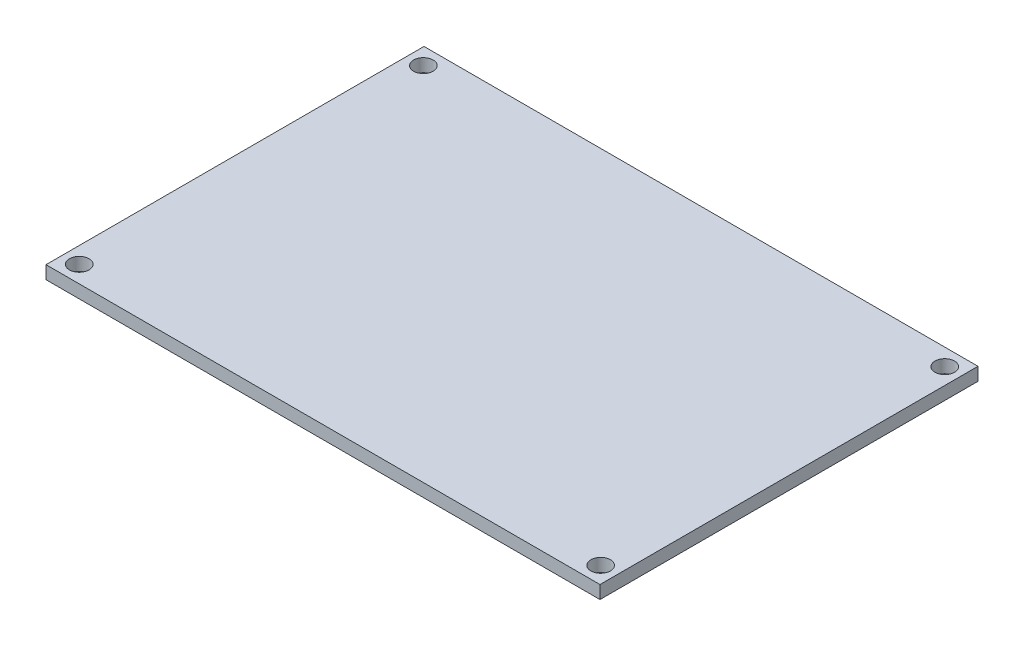
ISO-10303-21;
HEADER;
FILE_DESCRIPTION(('STEP AP214'),'2;1');
FILE_NAME('part.step','',(''),(''),'','','');
FILE_SCHEMA(('AUTOMOTIVE_DESIGN { 1 0 10303 214 1 1 1 1 }'));
ENDSEC;
DATA;
#1=APPLICATION_CONTEXT('core data for automotive mechanical design processes');
#2=APPLICATION_PROTOCOL_DEFINITION('international standard','automotive_design',2000,#1);
#3=PRODUCT_CONTEXT('',#1,'mechanical');
#4=PRODUCT('Part','Part','',(#3));
#5=PRODUCT_RELATED_PRODUCT_CATEGORY('part','',(#4));
#6=PRODUCT_DEFINITION_FORMATION('','',#4);
#7=PRODUCT_DEFINITION_CONTEXT('part definition',#1,'design');
#8=PRODUCT_DEFINITION('design','',#6,#7);
#9=PRODUCT_DEFINITION_SHAPE('','',#8);
#10=(LENGTH_UNIT() NAMED_UNIT(*) SI_UNIT(.MILLI.,.METRE.));
#11=(NAMED_UNIT(*) PLANE_ANGLE_UNIT() SI_UNIT($,.RADIAN.));
#12=(NAMED_UNIT(*) SI_UNIT($,.STERADIAN.) SOLID_ANGLE_UNIT());
#13=UNCERTAINTY_MEASURE_WITH_UNIT(LENGTH_MEASURE(1.E-05),#10,'distance_accuracy_value','');
#14=(GEOMETRIC_REPRESENTATION_CONTEXT(3) GLOBAL_UNCERTAINTY_ASSIGNED_CONTEXT((#13)) GLOBAL_UNIT_ASSIGNED_CONTEXT((#10,
#11,#12)) REPRESENTATION_CONTEXT('',''));
#15=CARTESIAN_POINT('',(0.,0.,0.));
#16=DIRECTION('',(0.,0.,1.));
#17=DIRECTION('',(1.,0.,0.));
#18=AXIS2_PLACEMENT_3D('',#15,#16,#17);
#19=CARTESIAN_POINT('',(42.5,2.,29.));
#20=DIRECTION('',(-1.,0.,0.));
#21=DIRECTION('',(0.,0.,1.));
#22=AXIS2_PLACEMENT_3D('',#19,#20,#21);
#23=PLANE('',#22);
#24=DIRECTION('',(0.,0.,-1.));
#25=VECTOR('',#24,1.);
#26=CARTESIAN_POINT('',(42.5,0.,29.));
#27=LINE('',#26,#25);
#28=CARTESIAN_POINT('',(42.5,0.,29.));
#29=VERTEX_POINT('',#28);
#30=CARTESIAN_POINT('',(42.5,0.,-29.));
#31=VERTEX_POINT('',#30);
#32=EDGE_CURVE('E102',#29,#31,#27,.T.);
#33=ORIENTED_EDGE('',*,*,#32,.T.);
#34=DIRECTION('',(0.,-1.,0.));
#35=VECTOR('',#34,1.);
#36=CARTESIAN_POINT('',(42.5,2.,-29.));
#37=LINE('',#36,#35);
#38=CARTESIAN_POINT('',(42.5,2.,-29.));
#39=VERTEX_POINT('',#38);
#40=EDGE_CURVE('E11',#39,#31,#37,.T.);
#41=ORIENTED_EDGE('',*,*,#40,.F.);
#42=DIRECTION('',(0.,0.,-1.));
#43=VECTOR('',#42,1.);
#44=CARTESIAN_POINT('',(42.5,2.,29.));
#45=LINE('',#44,#43);
#46=CARTESIAN_POINT('',(42.5,2.,29.));
#47=VERTEX_POINT('',#46);
#48=EDGE_CURVE('E95',#47,#39,#45,.T.);
#49=ORIENTED_EDGE('',*,*,#48,.F.);
#50=DIRECTION('',(0.,-1.,0.));
#51=VECTOR('',#50,1.);
#52=CARTESIAN_POINT('',(42.5,2.,29.));
#53=LINE('',#52,#51);
#54=EDGE_CURVE('E99',#47,#29,#53,.T.);
#55=ORIENTED_EDGE('',*,*,#54,.T.);
#56=EDGE_LOOP('',(#33,#41,#49,#55));
#57=FACE_BOUND('',#56,.T.);
#58=ADVANCED_FACE('F41',(#57),#23,.F.);
#59=CARTESIAN_POINT('',(-42.5,2.,-29.));
#60=DIRECTION('',(0.,0.,1.));
#61=DIRECTION('',(1.,0.,0.));
#62=AXIS2_PLACEMENT_3D('',#59,#60,#61);
#63=PLANE('',#62);
#64=DIRECTION('',(-1.,0.,0.));
#65=VECTOR('',#64,1.);
#66=CARTESIAN_POINT('',(-42.5,0.,-29.));
#67=LINE('',#66,#65);
#68=CARTESIAN_POINT('',(-42.5,0.,-29.));
#69=VERTEX_POINT('',#68);
#70=EDGE_CURVE('E96',#31,#69,#67,.T.);
#71=ORIENTED_EDGE('',*,*,#70,.T.);
#72=DIRECTION('',(0.,-1.,0.));
#73=VECTOR('',#72,1.);
#74=CARTESIAN_POINT('',(-42.5,2.,-29.));
#75=LINE('',#74,#73);
#76=CARTESIAN_POINT('',(-42.5,2.,-29.));
#77=VERTEX_POINT('',#76);
#78=EDGE_CURVE('E47',#77,#69,#75,.T.);
#79=ORIENTED_EDGE('',*,*,#78,.F.);
#80=DIRECTION('',(-1.,0.,0.));
#81=VECTOR('',#80,1.);
#82=CARTESIAN_POINT('',(-42.5,2.,-29.));
#83=LINE('',#82,#81);
#84=EDGE_CURVE('E87',#39,#77,#83,.T.);
#85=ORIENTED_EDGE('',*,*,#84,.F.);
#86=ORIENTED_EDGE('',*,*,#40,.T.);
#87=EDGE_LOOP('',(#71,#79,#85,#86));
#88=FACE_BOUND('',#87,.T.);
#89=ADVANCED_FACE('F92',(#88),#63,.F.);
#90=CARTESIAN_POINT('',(-42.5,2.,29.));
#91=DIRECTION('',(1.,0.,0.));
#92=DIRECTION('',(0.,0.,-1.));
#93=AXIS2_PLACEMENT_3D('',#90,#91,#92);
#94=PLANE('',#93);
#95=DIRECTION('',(0.,0.,1.));
#96=VECTOR('',#95,1.);
#97=CARTESIAN_POINT('',(-42.5,0.,29.));
#98=LINE('',#97,#96);
#99=CARTESIAN_POINT('',(-42.5,0.,29.));
#100=VERTEX_POINT('',#99);
#101=EDGE_CURVE('E74',#69,#100,#98,.T.);
#102=ORIENTED_EDGE('',*,*,#101,.T.);
#103=DIRECTION('',(0.,-1.,0.));
#104=VECTOR('',#103,1.);
#105=CARTESIAN_POINT('',(-42.5,2.,29.));
#106=LINE('',#105,#104);
#107=CARTESIAN_POINT('',(-42.5,2.,29.));
#108=VERTEX_POINT('',#107);
#109=EDGE_CURVE('E100',#108,#100,#106,.T.);
#110=ORIENTED_EDGE('',*,*,#109,.F.);
#111=DIRECTION('',(0.,0.,1.));
#112=VECTOR('',#111,1.);
#113=CARTESIAN_POINT('',(-42.5,2.,29.));
#114=LINE('',#113,#112);
#115=EDGE_CURVE('E89',#77,#108,#114,.T.);
#116=ORIENTED_EDGE('',*,*,#115,.F.);
#117=ORIENTED_EDGE('',*,*,#78,.T.);
#118=EDGE_LOOP('',(#102,#110,#116,#117));
#119=FACE_BOUND('',#118,.T.);
#120=ADVANCED_FACE('F98',(#119),#94,.F.);
#121=CARTESIAN_POINT('',(-42.5,2.,29.));
#122=DIRECTION('',(0.,0.,-1.));
#123=DIRECTION('',(-1.,0.,0.));
#124=AXIS2_PLACEMENT_3D('',#121,#122,#123);
#125=PLANE('',#124);
#126=DIRECTION('',(1.,0.,0.));
#127=VECTOR('',#126,1.);
#128=CARTESIAN_POINT('',(-42.5,0.,29.));
#129=LINE('',#128,#127);
#130=EDGE_CURVE('E76',#100,#29,#129,.T.);
#131=ORIENTED_EDGE('',*,*,#130,.T.);
#132=ORIENTED_EDGE('',*,*,#54,.F.);
#133=DIRECTION('',(1.,0.,0.));
#134=VECTOR('',#133,1.);
#135=CARTESIAN_POINT('',(-42.5,2.,29.));
#136=LINE('',#135,#134);
#137=EDGE_CURVE('E60',#108,#47,#136,.T.);
#138=ORIENTED_EDGE('',*,*,#137,.F.);
#139=ORIENTED_EDGE('',*,*,#109,.T.);
#140=EDGE_LOOP('',(#131,#132,#138,#139));
#141=FACE_BOUND('',#140,.T.);
#142=ADVANCED_FACE('F115',(#141),#125,.F.);
#143=CARTESIAN_POINT('',(0.,2.,0.));
#144=DIRECTION('',(0.,-1.,0.));
#145=DIRECTION('',(0.,0.,-1.));
#146=AXIS2_PLACEMENT_3D('',#143,#144,#145);
#147=PLANE('',#146);
#148=CARTESIAN_POINT('',(-40.,2.,26.4));
#149=DIRECTION('',(0.,1.,0.));
#150=DIRECTION('',(0.,0.,1.));
#151=AXIS2_PLACEMENT_3D('',#148,#149,#150);
#152=CIRCLE('',#151,1.5);
#153=CARTESIAN_POINT('',(-40.,2.,27.9));
#154=VERTEX_POINT('',#153);
#155=EDGE_CURVE('E130',#154,#154,#152,.T.);
#156=ORIENTED_EDGE('',*,*,#155,.F.);
#157=EDGE_LOOP('',(#156));
#158=FACE_BOUND('',#157,.T.);
#159=CARTESIAN_POINT('',(40.,2.,26.4));
#160=DIRECTION('',(0.,1.,0.));
#161=DIRECTION('',(0.,0.,1.));
#162=AXIS2_PLACEMENT_3D('',#159,#160,#161);
#163=CIRCLE('',#162,1.5);
#164=CARTESIAN_POINT('',(40.,2.,27.9));
#165=VERTEX_POINT('',#164);
#166=EDGE_CURVE('E132',#165,#165,#163,.T.);
#167=ORIENTED_EDGE('',*,*,#166,.F.);
#168=EDGE_LOOP('',(#167));
#169=FACE_BOUND('',#168,.T.);
#170=CARTESIAN_POINT('',(40.,2.,-26.4));
#171=DIRECTION('',(0.,1.,0.));
#172=DIRECTION('',(0.,0.,1.));
#173=AXIS2_PLACEMENT_3D('',#170,#171,#172);
#174=CIRCLE('',#173,1.5);
#175=CARTESIAN_POINT('',(40.,2.,-24.9));
#176=VERTEX_POINT('',#175);
#177=EDGE_CURVE('E122',#176,#176,#174,.T.);
#178=ORIENTED_EDGE('',*,*,#177,.F.);
#179=EDGE_LOOP('',(#178));
#180=FACE_BOUND('',#179,.T.);
#181=CARTESIAN_POINT('',(-40.,2.,-26.4));
#182=DIRECTION('',(0.,1.,0.));
#183=DIRECTION('',(0.,0.,1.));
#184=AXIS2_PLACEMENT_3D('',#181,#182,#183);
#185=CIRCLE('',#184,1.5);
#186=CARTESIAN_POINT('',(-40.,2.,-24.9));
#187=VERTEX_POINT('',#186);
#188=EDGE_CURVE('E117',#187,#187,#185,.T.);
#189=ORIENTED_EDGE('',*,*,#188,.F.);
#190=EDGE_LOOP('',(#189));
#191=FACE_BOUND('',#190,.T.);
#192=ORIENTED_EDGE('',*,*,#48,.T.);
#193=ORIENTED_EDGE('',*,*,#84,.T.);
#194=ORIENTED_EDGE('',*,*,#115,.T.);
#195=ORIENTED_EDGE('',*,*,#137,.T.);
#196=EDGE_LOOP('',(#192,#193,#194,#195));
#197=FACE_BOUND('',#196,.T.);
#198=ADVANCED_FACE('F86',(#158,#169,#180,#191,#197),#147,.F.);
#199=CARTESIAN_POINT('',(0.,0.,0.));
#200=DIRECTION('',(0.,-1.,0.));
#201=DIRECTION('',(0.,0.,-1.));
#202=AXIS2_PLACEMENT_3D('',#199,#200,#201);
#203=PLANE('',#202);
#204=CARTESIAN_POINT('',(-40.,0.,26.4));
#205=DIRECTION('',(0.,1.,0.));
#206=DIRECTION('',(0.,0.,1.));
#207=AXIS2_PLACEMENT_3D('',#204,#205,#206);
#208=CIRCLE('',#207,1.5);
#209=CARTESIAN_POINT('',(-40.,0.,27.9));
#210=VERTEX_POINT('',#209);
#211=EDGE_CURVE('E124',#210,#210,#208,.T.);
#212=ORIENTED_EDGE('',*,*,#211,.T.);
#213=EDGE_LOOP('',(#212));
#214=FACE_BOUND('',#213,.T.);
#215=CARTESIAN_POINT('',(40.,0.,26.4));
#216=DIRECTION('',(0.,1.,0.));
#217=DIRECTION('',(0.,0.,1.));
#218=AXIS2_PLACEMENT_3D('',#215,#216,#217);
#219=CIRCLE('',#218,1.5);
#220=CARTESIAN_POINT('',(40.,0.,27.9));
#221=VERTEX_POINT('',#220);
#222=EDGE_CURVE('E128',#221,#221,#219,.T.);
#223=ORIENTED_EDGE('',*,*,#222,.T.);
#224=EDGE_LOOP('',(#223));
#225=FACE_BOUND('',#224,.T.);
#226=CARTESIAN_POINT('',(40.,0.,-26.4));
#227=DIRECTION('',(0.,1.,0.));
#228=DIRECTION('',(0.,0.,1.));
#229=AXIS2_PLACEMENT_3D('',#226,#227,#228);
#230=CIRCLE('',#229,1.5);
#231=CARTESIAN_POINT('',(40.,0.,-24.9));
#232=VERTEX_POINT('',#231);
#233=EDGE_CURVE('E137',#232,#232,#230,.T.);
#234=ORIENTED_EDGE('',*,*,#233,.T.);
#235=EDGE_LOOP('',(#234));
#236=FACE_BOUND('',#235,.T.);
#237=CARTESIAN_POINT('',(-40.,0.,-26.4));
#238=DIRECTION('',(0.,1.,0.));
#239=DIRECTION('',(0.,0.,1.));
#240=AXIS2_PLACEMENT_3D('',#237,#238,#239);
#241=CIRCLE('',#240,1.5);
#242=CARTESIAN_POINT('',(-40.,0.,-24.9));
#243=VERTEX_POINT('',#242);
#244=EDGE_CURVE('E110',#243,#243,#241,.T.);
#245=ORIENTED_EDGE('',*,*,#244,.T.);
#246=EDGE_LOOP('',(#245));
#247=FACE_BOUND('',#246,.T.);
#248=ORIENTED_EDGE('',*,*,#32,.F.);
#249=ORIENTED_EDGE('',*,*,#130,.F.);
#250=ORIENTED_EDGE('',*,*,#101,.F.);
#251=ORIENTED_EDGE('',*,*,#70,.F.);
#252=EDGE_LOOP('',(#248,#249,#250,#251));
#253=FACE_BOUND('',#252,.T.);
#254=ADVANCED_FACE('F113',(#214,#225,#236,#247,#253),#203,.T.);
#255=CARTESIAN_POINT('',(-40.,0.,-26.4));
#256=DIRECTION('',(0.,1.,0.));
#257=DIRECTION('',(0.,0.,1.));
#258=AXIS2_PLACEMENT_3D('',#255,#256,#257);
#259=CYLINDRICAL_SURFACE('',#258,1.5);
#260=ORIENTED_EDGE('',*,*,#244,.F.);
#261=EDGE_LOOP('',(#260));
#262=FACE_BOUND('',#261,.T.);
#263=ORIENTED_EDGE('',*,*,#188,.T.);
#264=EDGE_LOOP('',(#263));
#265=FACE_BOUND('',#264,.T.);
#266=ADVANCED_FACE('F147',(#262,#265),#259,.F.);
#267=CARTESIAN_POINT('',(40.,0.,-26.4));
#268=DIRECTION('',(0.,1.,0.));
#269=DIRECTION('',(0.,0.,1.));
#270=AXIS2_PLACEMENT_3D('',#267,#268,#269);
#271=CYLINDRICAL_SURFACE('',#270,1.5);
#272=ORIENTED_EDGE('',*,*,#233,.F.);
#273=EDGE_LOOP('',(#272));
#274=FACE_BOUND('',#273,.T.);
#275=ORIENTED_EDGE('',*,*,#177,.T.);
#276=EDGE_LOOP('',(#275));
#277=FACE_BOUND('',#276,.T.);
#278=ADVANCED_FACE('F142',(#274,#277),#271,.F.);
#279=CARTESIAN_POINT('',(40.,0.,26.4));
#280=DIRECTION('',(0.,1.,0.));
#281=DIRECTION('',(0.,0.,1.));
#282=AXIS2_PLACEMENT_3D('',#279,#280,#281);
#283=CYLINDRICAL_SURFACE('',#282,1.5);
#284=ORIENTED_EDGE('',*,*,#222,.F.);
#285=EDGE_LOOP('',(#284));
#286=FACE_BOUND('',#285,.T.);
#287=ORIENTED_EDGE('',*,*,#166,.T.);
#288=EDGE_LOOP('',(#287));
#289=FACE_BOUND('',#288,.T.);
#290=ADVANCED_FACE('F158',(#286,#289),#283,.F.);
#291=CARTESIAN_POINT('',(-40.,0.,26.4));
#292=DIRECTION('',(0.,1.,0.));
#293=DIRECTION('',(0.,0.,1.));
#294=AXIS2_PLACEMENT_3D('',#291,#292,#293);
#295=CYLINDRICAL_SURFACE('',#294,1.5);
#296=ORIENTED_EDGE('',*,*,#211,.F.);
#297=EDGE_LOOP('',(#296));
#298=FACE_BOUND('',#297,.T.);
#299=ORIENTED_EDGE('',*,*,#155,.T.);
#300=EDGE_LOOP('',(#299));
#301=FACE_BOUND('',#300,.T.);
#302=ADVANCED_FACE('F207',(#298,#301),#295,.F.);
#303=CLOSED_SHELL('',(#58,#89,#120,#142,#198,#254,#266,#278,#290,#302));
#304=MANIFOLD_SOLID_BREP('B2',#303);
#305=ADVANCED_BREP_SHAPE_REPRESENTATION('',(#18,#304),#14);
#306=SHAPE_DEFINITION_REPRESENTATION(#9,#305);
ENDSEC;
END-ISO-10303-21;
